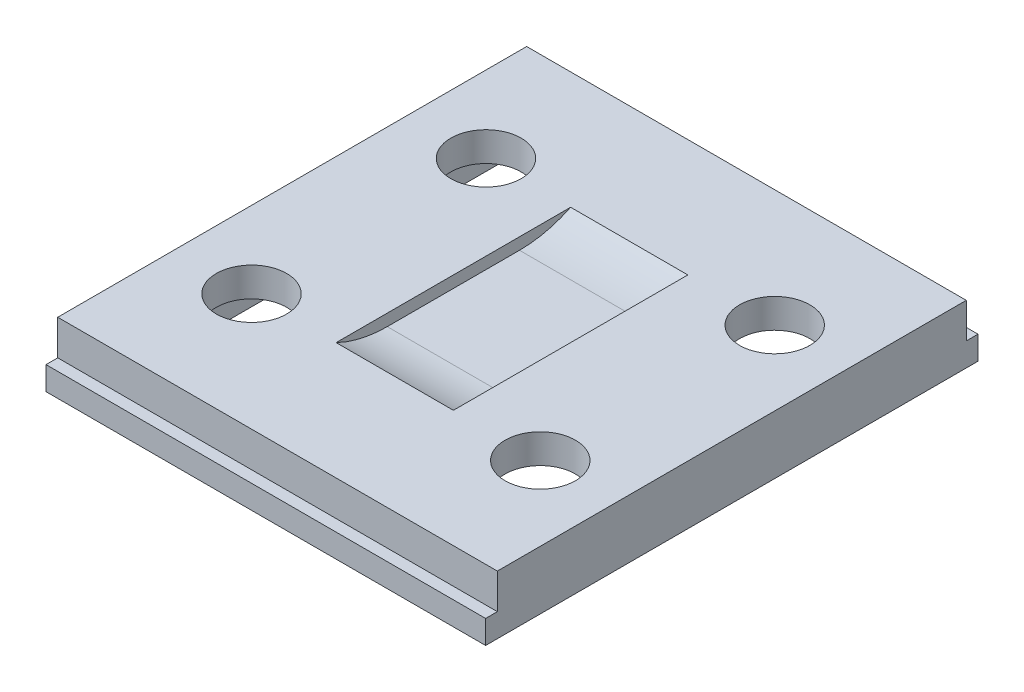
ISO-10303-21;
HEADER;
FILE_DESCRIPTION(('STEP AP214'),'2;1');
FILE_NAME('part.step','',(''),(''),'','','');
FILE_SCHEMA(('AUTOMOTIVE_DESIGN { 1 0 10303 214 1 1 1 1 }'));
ENDSEC;
DATA;
#1=APPLICATION_CONTEXT('core data for automotive mechanical design processes');
#2=APPLICATION_PROTOCOL_DEFINITION('international standard','automotive_design',2000,#1);
#3=PRODUCT_CONTEXT('',#1,'mechanical');
#4=PRODUCT('Part','Part','',(#3));
#5=PRODUCT_RELATED_PRODUCT_CATEGORY('part','',(#4));
#6=PRODUCT_DEFINITION_FORMATION('','',#4);
#7=PRODUCT_DEFINITION_CONTEXT('part definition',#1,'design');
#8=PRODUCT_DEFINITION('design','',#6,#7);
#9=PRODUCT_DEFINITION_SHAPE('','',#8);
#10=(LENGTH_UNIT() NAMED_UNIT(*) SI_UNIT(.MILLI.,.METRE.));
#11=(NAMED_UNIT(*) PLANE_ANGLE_UNIT() SI_UNIT($,.RADIAN.));
#12=(NAMED_UNIT(*) SI_UNIT($,.STERADIAN.) SOLID_ANGLE_UNIT());
#13=UNCERTAINTY_MEASURE_WITH_UNIT(LENGTH_MEASURE(1.E-05),#10,'distance_accuracy_value','');
#14=(GEOMETRIC_REPRESENTATION_CONTEXT(3) GLOBAL_UNCERTAINTY_ASSIGNED_CONTEXT((#13)) GLOBAL_UNIT_ASSIGNED_CONTEXT((#10,
#11,#12)) REPRESENTATION_CONTEXT('',''));
#15=CARTESIAN_POINT('',(0.,0.,0.));
#16=DIRECTION('',(0.,0.,1.));
#17=DIRECTION('',(1.,0.,0.));
#18=AXIS2_PLACEMENT_3D('',#15,#16,#17);
#19=CARTESIAN_POINT('',(-18.75,5.,-21.));
#20=DIRECTION('',(0.,0.,-1.));
#21=DIRECTION('',(-1.,0.,0.));
#22=AXIS2_PLACEMENT_3D('',#19,#20,#21);
#23=PLANE('',#22);
#24=DIRECTION('',(0.,-1.,0.));
#25=VECTOR('',#24,1.);
#26=CARTESIAN_POINT('',(-18.75,5.,-21.));
#27=LINE('',#26,#25);
#28=CARTESIAN_POINT('',(-18.75,2.,-21.));
#29=VERTEX_POINT('',#28);
#30=CARTESIAN_POINT('',(-18.75,0.,-21.));
#31=VERTEX_POINT('',#30);
#32=EDGE_CURVE('E307',#29,#31,#27,.T.);
#33=ORIENTED_EDGE('',*,*,#32,.F.);
#34=DIRECTION('',(-1.,0.,0.));
#35=VECTOR('',#34,1.);
#36=CARTESIAN_POINT('',(-18.75,2.,-21.));
#37=LINE('',#36,#35);
#38=CARTESIAN_POINT('',(18.75,2.,-21.));
#39=VERTEX_POINT('',#38);
#40=EDGE_CURVE('E263',#39,#29,#37,.T.);
#41=ORIENTED_EDGE('',*,*,#40,.F.);
#42=DIRECTION('',(0.,-1.,0.));
#43=VECTOR('',#42,1.);
#44=CARTESIAN_POINT('',(18.75,5.,-21.));
#45=LINE('',#44,#43);
#46=CARTESIAN_POINT('',(18.75,0.,-21.));
#47=VERTEX_POINT('',#46);
#48=EDGE_CURVE('E309',#39,#47,#45,.T.);
#49=ORIENTED_EDGE('',*,*,#48,.T.);
#50=DIRECTION('',(1.,0.,0.));
#51=VECTOR('',#50,1.);
#52=CARTESIAN_POINT('',(-18.75,0.,-21.));
#53=LINE('',#52,#51);
#54=EDGE_CURVE('E301',#31,#47,#53,.T.);
#55=ORIENTED_EDGE('',*,*,#54,.F.);
#56=EDGE_LOOP('',(#33,#41,#49,#55));
#57=FACE_BOUND('',#56,.T.);
#58=ADVANCED_FACE('F35',(#57),#23,.T.);
#59=CARTESIAN_POINT('',(-18.75,5.,21.));
#60=DIRECTION('',(0.,0.,-1.));
#61=DIRECTION('',(-1.,0.,0.));
#62=AXIS2_PLACEMENT_3D('',#59,#60,#61);
#63=PLANE('',#62);
#64=DIRECTION('',(0.,-1.,0.));
#65=VECTOR('',#64,1.);
#66=CARTESIAN_POINT('',(18.75,5.,21.));
#67=LINE('',#66,#65);
#68=CARTESIAN_POINT('',(18.75,2.,21.));
#69=VERTEX_POINT('',#68);
#70=CARTESIAN_POINT('',(18.75,0.,21.));
#71=VERTEX_POINT('',#70);
#72=EDGE_CURVE('E311',#69,#71,#67,.T.);
#73=ORIENTED_EDGE('',*,*,#72,.F.);
#74=DIRECTION('',(1.,0.,0.));
#75=VECTOR('',#74,1.);
#76=CARTESIAN_POINT('',(-18.75,2.,21.));
#77=LINE('',#76,#75);
#78=CARTESIAN_POINT('',(-18.75,2.,21.));
#79=VERTEX_POINT('',#78);
#80=EDGE_CURVE('E274',#79,#69,#77,.T.);
#81=ORIENTED_EDGE('',*,*,#80,.F.);
#82=DIRECTION('',(0.,-1.,0.));
#83=VECTOR('',#82,1.);
#84=CARTESIAN_POINT('',(-18.75,5.,21.));
#85=LINE('',#84,#83);
#86=CARTESIAN_POINT('',(-18.75,0.,21.));
#87=VERTEX_POINT('',#86);
#88=EDGE_CURVE('E295',#79,#87,#85,.T.);
#89=ORIENTED_EDGE('',*,*,#88,.T.);
#90=DIRECTION('',(1.,0.,0.));
#91=VECTOR('',#90,1.);
#92=CARTESIAN_POINT('',(-18.75,0.,21.));
#93=LINE('',#92,#91);
#94=EDGE_CURVE('E286',#87,#71,#93,.T.);
#95=ORIENTED_EDGE('',*,*,#94,.T.);
#96=EDGE_LOOP('',(#73,#81,#89,#95));
#97=FACE_BOUND('',#96,.T.);
#98=ADVANCED_FACE('F350',(#97),#63,.F.);
#99=CARTESIAN_POINT('',(18.75,5.,21.));
#100=DIRECTION('',(-1.,0.,0.));
#101=DIRECTION('',(0.,0.,1.));
#102=AXIS2_PLACEMENT_3D('',#99,#100,#101);
#103=PLANE('',#102);
#104=DIRECTION('',(0.,0.,-1.));
#105=VECTOR('',#104,1.);
#106=CARTESIAN_POINT('',(18.75,2.,-21.));
#107=LINE('',#106,#105);
#108=CARTESIAN_POINT('',(18.75,2.,-20.));
#109=VERTEX_POINT('',#108);
#110=EDGE_CURVE('E261',#109,#39,#107,.T.);
#111=ORIENTED_EDGE('',*,*,#110,.F.);
#112=DIRECTION('',(0.,1.,0.));
#113=VECTOR('',#112,1.);
#114=CARTESIAN_POINT('',(18.75,2.,-20.));
#115=LINE('',#114,#113);
#116=CARTESIAN_POINT('',(18.75,5.,-20.));
#117=VERTEX_POINT('',#116);
#118=EDGE_CURVE('E267',#109,#117,#115,.T.);
#119=ORIENTED_EDGE('',*,*,#118,.T.);
#120=DIRECTION('',(0.,0.,-1.));
#121=VECTOR('',#120,1.);
#122=CARTESIAN_POINT('',(18.75,5.,21.));
#123=LINE('',#122,#121);
#124=CARTESIAN_POINT('',(18.75,5.,20.));
#125=VERTEX_POINT('',#124);
#126=EDGE_CURVE('E288',#125,#117,#123,.T.);
#127=ORIENTED_EDGE('',*,*,#126,.F.);
#128=DIRECTION('',(0.,1.,0.));
#129=VECTOR('',#128,1.);
#130=CARTESIAN_POINT('',(18.75,2.,20.));
#131=LINE('',#130,#129);
#132=CARTESIAN_POINT('',(18.75,2.,20.));
#133=VERTEX_POINT('',#132);
#134=EDGE_CURVE('E281',#133,#125,#131,.T.);
#135=ORIENTED_EDGE('',*,*,#134,.F.);
#136=DIRECTION('',(0.,0.,-1.));
#137=VECTOR('',#136,1.);
#138=CARTESIAN_POINT('',(18.75,2.,21.));
#139=LINE('',#138,#137);
#140=EDGE_CURVE('E276',#69,#133,#139,.T.);
#141=ORIENTED_EDGE('',*,*,#140,.F.);
#142=ORIENTED_EDGE('',*,*,#72,.T.);
#143=DIRECTION('',(0.,0.,-1.));
#144=VECTOR('',#143,1.);
#145=CARTESIAN_POINT('',(18.75,0.,21.));
#146=LINE('',#145,#144);
#147=EDGE_CURVE('E298',#71,#47,#146,.T.);
#148=ORIENTED_EDGE('',*,*,#147,.T.);
#149=ORIENTED_EDGE('',*,*,#48,.F.);
#150=EDGE_LOOP('',(#111,#119,#127,#135,#141,#142,#148,#149));
#151=FACE_BOUND('',#150,.T.);
#152=ADVANCED_FACE('F356',(#151),#103,.F.);
#153=CARTESIAN_POINT('',(-18.75,5.,21.));
#154=DIRECTION('',(-1.,0.,0.));
#155=DIRECTION('',(0.,0.,1.));
#156=AXIS2_PLACEMENT_3D('',#153,#154,#155);
#157=PLANE('',#156);
#158=DIRECTION('',(0.,1.,0.));
#159=VECTOR('',#158,1.);
#160=CARTESIAN_POINT('',(-18.75,2.,-20.));
#161=LINE('',#160,#159);
#162=CARTESIAN_POINT('',(-18.75,2.,-20.));
#163=VERTEX_POINT('',#162);
#164=CARTESIAN_POINT('',(-18.75,5.,-20.));
#165=VERTEX_POINT('',#164);
#166=EDGE_CURVE('E265',#163,#165,#161,.T.);
#167=ORIENTED_EDGE('',*,*,#166,.F.);
#168=DIRECTION('',(0.,0.,1.));
#169=VECTOR('',#168,1.);
#170=CARTESIAN_POINT('',(-18.75,2.,-21.));
#171=LINE('',#170,#169);
#172=EDGE_CURVE('E255',#29,#163,#171,.T.);
#173=ORIENTED_EDGE('',*,*,#172,.F.);
#174=ORIENTED_EDGE('',*,*,#32,.T.);
#175=DIRECTION('',(0.,0.,-1.));
#176=VECTOR('',#175,1.);
#177=CARTESIAN_POINT('',(-18.75,0.,21.));
#178=LINE('',#177,#176);
#179=EDGE_CURVE('E292',#87,#31,#178,.T.);
#180=ORIENTED_EDGE('',*,*,#179,.F.);
#181=ORIENTED_EDGE('',*,*,#88,.F.);
#182=DIRECTION('',(0.,0.,1.));
#183=VECTOR('',#182,1.);
#184=CARTESIAN_POINT('',(-18.75,2.,21.));
#185=LINE('',#184,#183);
#186=CARTESIAN_POINT('',(-18.75,2.,20.));
#187=VERTEX_POINT('',#186);
#188=EDGE_CURVE('E272',#187,#79,#185,.T.);
#189=ORIENTED_EDGE('',*,*,#188,.F.);
#190=DIRECTION('',(0.,1.,0.));
#191=VECTOR('',#190,1.);
#192=CARTESIAN_POINT('',(-18.75,2.,20.));
#193=LINE('',#192,#191);
#194=CARTESIAN_POINT('',(-18.75,5.,20.));
#195=VERTEX_POINT('',#194);
#196=EDGE_CURVE('E283',#187,#195,#193,.T.);
#197=ORIENTED_EDGE('',*,*,#196,.T.);
#198=DIRECTION('',(0.,0.,-1.));
#199=VECTOR('',#198,1.);
#200=CARTESIAN_POINT('',(-18.75,5.,21.));
#201=LINE('',#200,#199);
#202=EDGE_CURVE('E291',#195,#165,#201,.T.);
#203=ORIENTED_EDGE('',*,*,#202,.T.);
#204=EDGE_LOOP('',(#167,#173,#174,#180,#181,#189,#197,#203));
#205=FACE_BOUND('',#204,.T.);
#206=ADVANCED_FACE('F361',(#205),#157,.T.);
#207=CARTESIAN_POINT('',(0.,5.,0.));
#208=DIRECTION('',(0.,1.,0.));
#209=DIRECTION('',(0.,0.,1.));
#210=AXIS2_PLACEMENT_3D('',#207,#208,#209);
#211=PLANE('',#210);
#212=CARTESIAN_POINT('',(-12.2200025291193,5.,-10.));
#213=DIRECTION('',(0.,1.,0.));
#214=DIRECTION('',(0.,0.,1.));
#215=AXIS2_PLACEMENT_3D('',#212,#213,#214);
#216=CIRCLE('',#215,3.);
#217=CARTESIAN_POINT('',(-12.2200025291193,5.,-7.));
#218=VERTEX_POINT('',#217);
#219=EDGE_CURVE('E488',#218,#218,#216,.T.);
#220=ORIENTED_EDGE('',*,*,#219,.F.);
#221=EDGE_LOOP('',(#220));
#222=FACE_BOUND('',#221,.T.);
#223=CARTESIAN_POINT('',(12.4119716573148,5.,10.));
#224=DIRECTION('',(0.,1.,0.));
#225=DIRECTION('',(0.,0.,1.));
#226=AXIS2_PLACEMENT_3D('',#223,#224,#225);
#227=CIRCLE('',#226,3.);
#228=CARTESIAN_POINT('',(12.4119716573148,5.,13.));
#229=VERTEX_POINT('',#228);
#230=EDGE_CURVE('E481',#229,#229,#227,.T.);
#231=ORIENTED_EDGE('',*,*,#230,.F.);
#232=EDGE_LOOP('',(#231));
#233=FACE_BOUND('',#232,.T.);
#234=CARTESIAN_POINT('',(12.4119716573148,5.,-10.));
#235=DIRECTION('',(0.,1.,0.));
#236=DIRECTION('',(0.,0.,1.));
#237=AXIS2_PLACEMENT_3D('',#234,#235,#236);
#238=CIRCLE('',#237,3.);
#239=CARTESIAN_POINT('',(12.4119716573148,5.,-7.));
#240=VERTEX_POINT('',#239);
#241=EDGE_CURVE('E478',#240,#240,#238,.T.);
#242=ORIENTED_EDGE('',*,*,#241,.F.);
#243=EDGE_LOOP('',(#242));
#244=FACE_BOUND('',#243,.T.);
#245=CARTESIAN_POINT('',(-12.2200025291193,5.,10.));
#246=DIRECTION('',(0.,1.,0.));
#247=DIRECTION('',(0.,0.,1.));
#248=AXIS2_PLACEMENT_3D('',#245,#246,#247);
#249=CIRCLE('',#248,3.);
#250=CARTESIAN_POINT('',(-12.2200025291193,5.,13.));
#251=VERTEX_POINT('',#250);
#252=EDGE_CURVE('E487',#251,#251,#249,.T.);
#253=ORIENTED_EDGE('',*,*,#252,.F.);
#254=EDGE_LOOP('',(#253));
#255=FACE_BOUND('',#254,.T.);
#256=DIRECTION('',(0.,0.,-1.));
#257=VECTOR('',#256,1.);
#258=CARTESIAN_POINT('',(5.,5.,10.));
#259=LINE('',#258,#257);
#260=CARTESIAN_POINT('',(5.,5.,10.));
#261=VERTEX_POINT('',#260);
#262=CARTESIAN_POINT('',(5.,5.,-10.));
#263=VERTEX_POINT('',#262);
#264=EDGE_CURVE('E240',#261,#263,#259,.T.);
#265=ORIENTED_EDGE('',*,*,#264,.F.);
#266=DIRECTION('',(1.,0.,0.));
#267=VECTOR('',#266,1.);
#268=CARTESIAN_POINT('',(-5.,5.,10.));
#269=LINE('',#268,#267);
#270=CARTESIAN_POINT('',(-5.,5.,10.));
#271=VERTEX_POINT('',#270);
#272=EDGE_CURVE('E244',#271,#261,#269,.T.);
#273=ORIENTED_EDGE('',*,*,#272,.F.);
#274=DIRECTION('',(0.,0.,1.));
#275=VECTOR('',#274,1.);
#276=CARTESIAN_POINT('',(-5.,5.,10.));
#277=LINE('',#276,#275);
#278=CARTESIAN_POINT('',(-5.,5.,-10.));
#279=VERTEX_POINT('',#278);
#280=EDGE_CURVE('E251',#279,#271,#277,.T.);
#281=ORIENTED_EDGE('',*,*,#280,.F.);
#282=DIRECTION('',(-1.,0.,0.));
#283=VECTOR('',#282,1.);
#284=CARTESIAN_POINT('',(-5.,5.,-10.));
#285=LINE('',#284,#283);
#286=EDGE_CURVE('E248',#263,#279,#285,.T.);
#287=ORIENTED_EDGE('',*,*,#286,.F.);
#288=EDGE_LOOP('',(#265,#273,#281,#287));
#289=FACE_BOUND('',#288,.T.);
#290=DIRECTION('',(1.,0.,0.));
#291=VECTOR('',#290,1.);
#292=CARTESIAN_POINT('',(-18.75,5.,-20.));
#293=LINE('',#292,#291);
#294=EDGE_CURVE('E246',#165,#117,#293,.T.);
#295=ORIENTED_EDGE('',*,*,#294,.F.);
#296=ORIENTED_EDGE('',*,*,#202,.F.);
#297=DIRECTION('',(-1.,0.,0.));
#298=VECTOR('',#297,1.);
#299=CARTESIAN_POINT('',(-18.75,5.,20.));
#300=LINE('',#299,#298);
#301=EDGE_CURVE('E270',#125,#195,#300,.T.);
#302=ORIENTED_EDGE('',*,*,#301,.F.);
#303=ORIENTED_EDGE('',*,*,#126,.T.);
#304=EDGE_LOOP('',(#295,#296,#302,#303));
#305=FACE_BOUND('',#304,.T.);
#306=ADVANCED_FACE('F332',(#222,#233,#244,#255,#289,#305),#211,.T.);
#307=CARTESIAN_POINT('',(0.,0.,0.));
#308=DIRECTION('',(0.,1.,0.));
#309=DIRECTION('',(0.,0.,1.));
#310=AXIS2_PLACEMENT_3D('',#307,#308,#309);
#311=PLANE('',#310);
#312=DIRECTION('',(0.,0.,-1.));
#313=VECTOR('',#312,1.);
#314=CARTESIAN_POINT('',(-16.25,0.,21.));
#315=LINE('',#314,#313);
#316=CARTESIAN_POINT('',(-16.25,0.,17.5));
#317=VERTEX_POINT('',#316);
#318=CARTESIAN_POINT('',(-16.25,0.,-17.5));
#319=VERTEX_POINT('',#318);
#320=EDGE_CURVE('E193',#317,#319,#315,.T.);
#321=ORIENTED_EDGE('',*,*,#320,.F.);
#322=DIRECTION('',(1.,0.,0.));
#323=VECTOR('',#322,1.);
#324=CARTESIAN_POINT('',(-18.75,0.,17.5));
#325=LINE('',#324,#323);
#326=CARTESIAN_POINT('',(16.25,0.,17.5));
#327=VERTEX_POINT('',#326);
#328=EDGE_CURVE('E238',#317,#327,#325,.T.);
#329=ORIENTED_EDGE('',*,*,#328,.T.);
#330=DIRECTION('',(0.,0.,-1.));
#331=VECTOR('',#330,1.);
#332=CARTESIAN_POINT('',(16.25,0.,21.));
#333=LINE('',#332,#331);
#334=CARTESIAN_POINT('',(16.25,0.,-17.5));
#335=VERTEX_POINT('',#334);
#336=EDGE_CURVE('E175',#327,#335,#333,.T.);
#337=ORIENTED_EDGE('',*,*,#336,.T.);
#338=DIRECTION('',(1.,0.,0.));
#339=VECTOR('',#338,1.);
#340=CARTESIAN_POINT('',(0.,0.,-17.5));
#341=LINE('',#340,#339);
#342=EDGE_CURVE('E234',#319,#335,#341,.T.);
#343=ORIENTED_EDGE('',*,*,#342,.F.);
#344=EDGE_LOOP('',(#321,#329,#337,#343));
#345=FACE_BOUND('',#344,.T.);
#346=ORIENTED_EDGE('',*,*,#94,.F.);
#347=ORIENTED_EDGE('',*,*,#179,.T.);
#348=ORIENTED_EDGE('',*,*,#54,.T.);
#349=ORIENTED_EDGE('',*,*,#147,.F.);
#350=EDGE_LOOP('',(#346,#347,#348,#349));
#351=FACE_BOUND('',#350,.T.);
#352=ADVANCED_FACE('F398',(#345,#351),#311,.F.);
#353=CARTESIAN_POINT('',(-18.75,2.,20.));
#354=DIRECTION('',(0.,0.,-1.));
#355=DIRECTION('',(-1.,0.,0.));
#356=AXIS2_PLACEMENT_3D('',#353,#354,#355);
#357=PLANE('',#356);
#358=ORIENTED_EDGE('',*,*,#301,.T.);
#359=ORIENTED_EDGE('',*,*,#196,.F.);
#360=DIRECTION('',(-1.,0.,0.));
#361=VECTOR('',#360,1.);
#362=CARTESIAN_POINT('',(-18.75,2.,20.));
#363=LINE('',#362,#361);
#364=EDGE_CURVE('E278',#133,#187,#363,.T.);
#365=ORIENTED_EDGE('',*,*,#364,.F.);
#366=ORIENTED_EDGE('',*,*,#134,.T.);
#367=EDGE_LOOP('',(#358,#359,#365,#366));
#368=FACE_BOUND('',#367,.T.);
#369=ADVANCED_FACE('F390',(#368),#357,.F.);
#370=CARTESIAN_POINT('',(0.,2.,0.));
#371=DIRECTION('',(0.,-1.,0.));
#372=DIRECTION('',(0.,0.,-1.));
#373=AXIS2_PLACEMENT_3D('',#370,#371,#372);
#374=PLANE('',#373);
#375=ORIENTED_EDGE('',*,*,#188,.T.);
#376=ORIENTED_EDGE('',*,*,#80,.T.);
#377=ORIENTED_EDGE('',*,*,#140,.T.);
#378=ORIENTED_EDGE('',*,*,#364,.T.);
#379=EDGE_LOOP('',(#375,#376,#377,#378));
#380=FACE_BOUND('',#379,.T.);
#381=ADVANCED_FACE('F393',(#380),#374,.F.);
#382=CARTESIAN_POINT('',(-18.75,2.,-20.));
#383=DIRECTION('',(0.,0.,1.));
#384=DIRECTION('',(1.,0.,0.));
#385=AXIS2_PLACEMENT_3D('',#382,#383,#384);
#386=PLANE('',#385);
#387=ORIENTED_EDGE('',*,*,#294,.T.);
#388=ORIENTED_EDGE('',*,*,#118,.F.);
#389=DIRECTION('',(1.,0.,0.));
#390=VECTOR('',#389,1.);
#391=CARTESIAN_POINT('',(-18.75,2.,-20.));
#392=LINE('',#391,#390);
#393=EDGE_CURVE('E258',#163,#109,#392,.T.);
#394=ORIENTED_EDGE('',*,*,#393,.F.);
#395=ORIENTED_EDGE('',*,*,#166,.T.);
#396=EDGE_LOOP('',(#387,#388,#394,#395));
#397=FACE_BOUND('',#396,.T.);
#398=ADVANCED_FACE('F383',(#397),#386,.F.);
#399=CARTESIAN_POINT('',(0.,2.,0.));
#400=DIRECTION('',(0.,1.,0.));
#401=DIRECTION('',(0.,0.,1.));
#402=AXIS2_PLACEMENT_3D('',#399,#400,#401);
#403=PLANE('',#402);
#404=ORIENTED_EDGE('',*,*,#172,.T.);
#405=ORIENTED_EDGE('',*,*,#393,.T.);
#406=ORIENTED_EDGE('',*,*,#110,.T.);
#407=ORIENTED_EDGE('',*,*,#40,.T.);
#408=EDGE_LOOP('',(#404,#405,#406,#407));
#409=FACE_BOUND('',#408,.T.);
#410=ADVANCED_FACE('F374',(#409),#403,.T.);
#411=CARTESIAN_POINT('',(5.,4.,10.));
#412=DIRECTION('',(1.,0.,0.));
#413=DIRECTION('',(0.,0.,-1.));
#414=AXIS2_PLACEMENT_3D('',#411,#412,#413);
#415=PLANE('',#414);
#416=DIRECTION('',(0.,0.,-1.));
#417=VECTOR('',#416,1.);
#418=CARTESIAN_POINT('',(5.,4.,10.));
#419=LINE('',#418,#417);
#420=CARTESIAN_POINT('',(5.,4.,5.64110105645933));
#421=VERTEX_POINT('',#420);
#422=CARTESIAN_POINT('',(5.,4.,-5.64110105645933));
#423=VERTEX_POINT('',#422);
#424=EDGE_CURVE('E241',#421,#423,#419,.T.);
#425=ORIENTED_EDGE('',*,*,#424,.F.);
#426=CARTESIAN_POINT('',(5.,14.,5.64110105645933));
#427=DIRECTION('',(1.,0.,0.));
#428=DIRECTION('',(0.,0.,-1.));
#429=AXIS2_PLACEMENT_3D('',#426,#427,#428);
#430=CIRCLE('',#429,10.);
#431=EDGE_CURVE('E43',#421,#261,#430,.F.);
#432=ORIENTED_EDGE('',*,*,#431,.T.);
#433=ORIENTED_EDGE('',*,*,#264,.T.);
#434=CARTESIAN_POINT('',(5.,14.,-5.64110105645933));
#435=DIRECTION('',(1.,0.,0.));
#436=DIRECTION('',(0.,0.,-1.));
#437=AXIS2_PLACEMENT_3D('',#434,#435,#436);
#438=CIRCLE('',#437,10.);
#439=EDGE_CURVE('E318',#263,#423,#438,.F.);
#440=ORIENTED_EDGE('',*,*,#439,.T.);
#441=EDGE_LOOP('',(#425,#432,#433,#440));
#442=FACE_BOUND('',#441,.T.);
#443=ADVANCED_FACE('F326',(#442),#415,.F.);
#444=CARTESIAN_POINT('',(-5.,4.,10.));
#445=DIRECTION('',(-1.,0.,0.));
#446=DIRECTION('',(0.,0.,1.));
#447=AXIS2_PLACEMENT_3D('',#444,#445,#446);
#448=PLANE('',#447);
#449=ORIENTED_EDGE('',*,*,#280,.T.);
#450=CARTESIAN_POINT('',(-5.,14.,5.64110105645933));
#451=DIRECTION('',(-1.,0.,0.));
#452=DIRECTION('',(0.,0.,1.));
#453=AXIS2_PLACEMENT_3D('',#450,#451,#452);
#454=CIRCLE('',#453,10.);
#455=CARTESIAN_POINT('',(-5.,4.,5.64110105645933));
#456=VERTEX_POINT('',#455);
#457=EDGE_CURVE('E11',#271,#456,#454,.F.);
#458=ORIENTED_EDGE('',*,*,#457,.T.);
#459=DIRECTION('',(0.,0.,1.));
#460=VECTOR('',#459,1.);
#461=CARTESIAN_POINT('',(-5.,4.,10.));
#462=LINE('',#461,#460);
#463=CARTESIAN_POINT('',(-5.,4.,-5.64110105645933));
#464=VERTEX_POINT('',#463);
#465=EDGE_CURVE('E243',#464,#456,#462,.T.);
#466=ORIENTED_EDGE('',*,*,#465,.F.);
#467=CARTESIAN_POINT('',(-5.,14.,-5.64110105645933));
#468=DIRECTION('',(-1.,0.,0.));
#469=DIRECTION('',(0.,0.,1.));
#470=AXIS2_PLACEMENT_3D('',#467,#468,#469);
#471=CIRCLE('',#470,10.);
#472=EDGE_CURVE('E316',#464,#279,#471,.F.);
#473=ORIENTED_EDGE('',*,*,#472,.T.);
#474=EDGE_LOOP('',(#449,#458,#466,#473));
#475=FACE_BOUND('',#474,.T.);
#476=ADVANCED_FACE('F339',(#475),#448,.F.);
#477=CARTESIAN_POINT('',(0.,4.,0.));
#478=DIRECTION('',(0.,-1.,0.));
#479=DIRECTION('',(0.,0.,-1.));
#480=AXIS2_PLACEMENT_3D('',#477,#478,#479);
#481=PLANE('',#480);
#482=ORIENTED_EDGE('',*,*,#465,.T.);
#483=DIRECTION('',(-1.,0.,0.));
#484=VECTOR('',#483,1.);
#485=CARTESIAN_POINT('',(0.,4.,5.64110105645933));
#486=LINE('',#485,#484);
#487=EDGE_CURVE('E321',#456,#421,#486,.F.);
#488=ORIENTED_EDGE('',*,*,#487,.T.);
#489=ORIENTED_EDGE('',*,*,#424,.T.);
#490=DIRECTION('',(1.,0.,0.));
#491=VECTOR('',#490,1.);
#492=CARTESIAN_POINT('',(0.,4.,-5.64110105645933));
#493=LINE('',#492,#491);
#494=EDGE_CURVE('E313',#423,#464,#493,.F.);
#495=ORIENTED_EDGE('',*,*,#494,.T.);
#496=EDGE_LOOP('',(#482,#488,#489,#495));
#497=FACE_BOUND('',#496,.T.);
#498=ADVANCED_FACE('F337',(#497),#481,.F.);
#499=CARTESIAN_POINT('',(-5.,14.,-5.64110105645933));
#500=DIRECTION('',(1.,0.,0.));
#501=DIRECTION('',(0.,0.,-1.));
#502=AXIS2_PLACEMENT_3D('',#499,#500,#501);
#503=CYLINDRICAL_SURFACE('',#502,10.);
#504=ORIENTED_EDGE('',*,*,#439,.F.);
#505=ORIENTED_EDGE('',*,*,#286,.T.);
#506=ORIENTED_EDGE('',*,*,#472,.F.);
#507=ORIENTED_EDGE('',*,*,#494,.F.);
#508=EDGE_LOOP('',(#504,#505,#506,#507));
#509=FACE_BOUND('',#508,.T.);
#510=ADVANCED_FACE('F341',(#509),#503,.F.);
#511=CARTESIAN_POINT('',(-5.,14.,5.64110105645933));
#512=DIRECTION('',(-1.,0.,0.));
#513=DIRECTION('',(0.,0.,1.));
#514=AXIS2_PLACEMENT_3D('',#511,#512,#513);
#515=CYLINDRICAL_SURFACE('',#514,10.);
#516=ORIENTED_EDGE('',*,*,#457,.F.);
#517=ORIENTED_EDGE('',*,*,#272,.T.);
#518=ORIENTED_EDGE('',*,*,#431,.F.);
#519=ORIENTED_EDGE('',*,*,#487,.F.);
#520=EDGE_LOOP('',(#516,#517,#518,#519));
#521=FACE_BOUND('',#520,.T.);
#522=ADVANCED_FACE('F37',(#521),#515,.F.);
#523=CARTESIAN_POINT('',(16.25,5.,21.));
#524=DIRECTION('',(-1.,0.,0.));
#525=DIRECTION('',(0.,0.,1.));
#526=AXIS2_PLACEMENT_3D('',#523,#524,#525);
#527=PLANE('',#526);
#528=ORIENTED_EDGE('',*,*,#336,.F.);
#529=DIRECTION('',(0.,1.,0.));
#530=VECTOR('',#529,1.);
#531=CARTESIAN_POINT('',(16.25,2.,17.5));
#532=LINE('',#531,#530);
#533=CARTESIAN_POINT('',(16.25,2.5,17.5));
#534=VERTEX_POINT('',#533);
#535=EDGE_CURVE('E169',#327,#534,#532,.T.);
#536=ORIENTED_EDGE('',*,*,#535,.T.);
#537=DIRECTION('',(0.,0.,-1.));
#538=VECTOR('',#537,1.);
#539=CARTESIAN_POINT('',(16.25,2.5,21.));
#540=LINE('',#539,#538);
#541=CARTESIAN_POINT('',(16.25,2.5,-17.5));
#542=VERTEX_POINT('',#541);
#543=EDGE_CURVE('E173',#534,#542,#540,.T.);
#544=ORIENTED_EDGE('',*,*,#543,.T.);
#545=DIRECTION('',(0.,1.,0.));
#546=VECTOR('',#545,1.);
#547=CARTESIAN_POINT('',(16.25,5.,-17.5));
#548=LINE('',#547,#546);
#549=EDGE_CURVE('E50',#335,#542,#548,.T.);
#550=ORIENTED_EDGE('',*,*,#549,.F.);
#551=EDGE_LOOP('',(#528,#536,#544,#550));
#552=FACE_BOUND('',#551,.T.);
#553=ADVANCED_FACE('F171',(#552),#527,.T.);
#554=CARTESIAN_POINT('',(-16.25,5.,21.));
#555=DIRECTION('',(-1.,0.,0.));
#556=DIRECTION('',(0.,0.,1.));
#557=AXIS2_PLACEMENT_3D('',#554,#555,#556);
#558=PLANE('',#557);
#559=DIRECTION('',(0.,1.,0.));
#560=VECTOR('',#559,1.);
#561=CARTESIAN_POINT('',(-16.25,5.,-17.5));
#562=LINE('',#561,#560);
#563=CARTESIAN_POINT('',(-16.25,2.5,-17.5));
#564=VERTEX_POINT('',#563);
#565=EDGE_CURVE('E201',#319,#564,#562,.T.);
#566=ORIENTED_EDGE('',*,*,#565,.T.);
#567=DIRECTION('',(0.,0.,-1.));
#568=VECTOR('',#567,1.);
#569=CARTESIAN_POINT('',(-16.25,2.5,21.));
#570=LINE('',#569,#568);
#571=CARTESIAN_POINT('',(-16.25,2.5,17.5));
#572=VERTEX_POINT('',#571);
#573=EDGE_CURVE('E192',#572,#564,#570,.T.);
#574=ORIENTED_EDGE('',*,*,#573,.F.);
#575=DIRECTION('',(0.,1.,0.));
#576=VECTOR('',#575,1.);
#577=CARTESIAN_POINT('',(-16.25,2.,17.5));
#578=LINE('',#577,#576);
#579=EDGE_CURVE('E178',#317,#572,#578,.T.);
#580=ORIENTED_EDGE('',*,*,#579,.F.);
#581=ORIENTED_EDGE('',*,*,#320,.T.);
#582=EDGE_LOOP('',(#566,#574,#580,#581));
#583=FACE_BOUND('',#582,.T.);
#584=ADVANCED_FACE('F449',(#583),#558,.F.);
#585=CARTESIAN_POINT('',(0.,2.5,0.));
#586=DIRECTION('',(0.,1.,0.));
#587=DIRECTION('',(0.,0.,1.));
#588=AXIS2_PLACEMENT_3D('',#585,#586,#587);
#589=PLANE('',#588);
#590=CARTESIAN_POINT('',(-12.2200025291193,2.5,-10.));
#591=DIRECTION('',(0.,1.,0.));
#592=DIRECTION('',(0.,0.,1.));
#593=AXIS2_PLACEMENT_3D('',#590,#591,#592);
#594=CIRCLE('',#593,3.);
#595=CARTESIAN_POINT('',(-12.2200025291193,2.5,-7.));
#596=VERTEX_POINT('',#595);
#597=EDGE_CURVE('E484',#596,#596,#594,.T.);
#598=ORIENTED_EDGE('',*,*,#597,.T.);
#599=EDGE_LOOP('',(#598));
#600=FACE_BOUND('',#599,.T.);
#601=CARTESIAN_POINT('',(12.4119716573148,2.5,10.));
#602=DIRECTION('',(0.,1.,0.));
#603=DIRECTION('',(0.,0.,1.));
#604=AXIS2_PLACEMENT_3D('',#601,#602,#603);
#605=CIRCLE('',#604,3.);
#606=CARTESIAN_POINT('',(12.4119716573148,2.5,13.));
#607=VERTEX_POINT('',#606);
#608=EDGE_CURVE('E491',#607,#607,#605,.T.);
#609=ORIENTED_EDGE('',*,*,#608,.T.);
#610=EDGE_LOOP('',(#609));
#611=FACE_BOUND('',#610,.T.);
#612=CARTESIAN_POINT('',(12.4119716573148,2.5,-10.));
#613=DIRECTION('',(0.,1.,0.));
#614=DIRECTION('',(0.,0.,1.));
#615=AXIS2_PLACEMENT_3D('',#612,#613,#614);
#616=CIRCLE('',#615,3.);
#617=CARTESIAN_POINT('',(12.4119716573148,2.5,-7.));
#618=VERTEX_POINT('',#617);
#619=EDGE_CURVE('E475',#618,#618,#616,.T.);
#620=ORIENTED_EDGE('',*,*,#619,.T.);
#621=EDGE_LOOP('',(#620));
#622=FACE_BOUND('',#621,.T.);
#623=CARTESIAN_POINT('',(-12.2200025291193,2.5,10.));
#624=DIRECTION('',(0.,1.,0.));
#625=DIRECTION('',(0.,0.,1.));
#626=AXIS2_PLACEMENT_3D('',#623,#624,#625);
#627=CIRCLE('',#626,3.);
#628=CARTESIAN_POINT('',(-12.2200025291193,2.5,13.));
#629=VERTEX_POINT('',#628);
#630=EDGE_CURVE('E207',#629,#629,#627,.T.);
#631=ORIENTED_EDGE('',*,*,#630,.T.);
#632=EDGE_LOOP('',(#631));
#633=FACE_BOUND('',#632,.T.);
#634=DIRECTION('',(0.,0.,-1.));
#635=VECTOR('',#634,1.);
#636=CARTESIAN_POINT('',(7.5,2.5,0.));
#637=LINE('',#636,#635);
#638=CARTESIAN_POINT('',(7.5,2.5,10.5400805420257));
#639=VERTEX_POINT('',#638);
#640=CARTESIAN_POINT('',(7.5,2.5,-10.5400805420257));
#641=VERTEX_POINT('',#640);
#642=EDGE_CURVE('E204',#639,#641,#637,.T.);
#643=ORIENTED_EDGE('',*,*,#642,.T.);
#644=DIRECTION('',(1.,0.,0.));
#645=VECTOR('',#644,1.);
#646=CARTESIAN_POINT('',(7.5,2.5,-10.5400805420257));
#647=LINE('',#646,#645);
#648=CARTESIAN_POINT('',(-7.5,2.5,-10.5400805420257));
#649=VERTEX_POINT('',#648);
#650=EDGE_CURVE('E206',#641,#649,#647,.F.);
#651=ORIENTED_EDGE('',*,*,#650,.T.);
#652=DIRECTION('',(0.,0.,1.));
#653=VECTOR('',#652,1.);
#654=CARTESIAN_POINT('',(-7.5,2.5,0.));
#655=LINE('',#654,#653);
#656=CARTESIAN_POINT('',(-7.5,2.5,10.5400805420257));
#657=VERTEX_POINT('',#656);
#658=EDGE_CURVE('E212',#649,#657,#655,.T.);
#659=ORIENTED_EDGE('',*,*,#658,.T.);
#660=DIRECTION('',(-1.,0.,0.));
#661=VECTOR('',#660,1.);
#662=CARTESIAN_POINT('',(-7.5,2.5,10.5400805420257));
#663=LINE('',#662,#661);
#664=EDGE_CURVE('E208',#657,#639,#663,.F.);
#665=ORIENTED_EDGE('',*,*,#664,.T.);
#666=EDGE_LOOP('',(#643,#651,#659,#665));
#667=FACE_BOUND('',#666,.T.);
#668=DIRECTION('',(1.,0.,0.));
#669=VECTOR('',#668,1.);
#670=CARTESIAN_POINT('',(0.,2.5,-17.5));
#671=LINE('',#670,#669);
#672=EDGE_CURVE('E191',#564,#542,#671,.T.);
#673=ORIENTED_EDGE('',*,*,#672,.T.);
#674=ORIENTED_EDGE('',*,*,#543,.F.);
#675=DIRECTION('',(-1.,0.,0.));
#676=VECTOR('',#675,1.);
#677=CARTESIAN_POINT('',(0.,2.5,17.5));
#678=LINE('',#677,#676);
#679=EDGE_CURVE('E179',#534,#572,#678,.T.);
#680=ORIENTED_EDGE('',*,*,#679,.T.);
#681=ORIENTED_EDGE('',*,*,#573,.T.);
#682=EDGE_LOOP('',(#673,#674,#680,#681));
#683=FACE_BOUND('',#682,.T.);
#684=ADVANCED_FACE('F189',(#600,#611,#622,#633,#667,#683),#589,.F.);
#685=CARTESIAN_POINT('',(-18.75,2.,17.5));
#686=DIRECTION('',(0.,0.,-1.));
#687=DIRECTION('',(-1.,0.,0.));
#688=AXIS2_PLACEMENT_3D('',#685,#686,#687);
#689=PLANE('',#688);
#690=ORIENTED_EDGE('',*,*,#579,.T.);
#691=ORIENTED_EDGE('',*,*,#679,.F.);
#692=ORIENTED_EDGE('',*,*,#535,.F.);
#693=ORIENTED_EDGE('',*,*,#328,.F.);
#694=EDGE_LOOP('',(#690,#691,#692,#693));
#695=FACE_BOUND('',#694,.T.);
#696=ADVANCED_FACE('F182',(#695),#689,.T.);
#697=CARTESIAN_POINT('',(-18.75,2.,-17.5));
#698=DIRECTION('',(0.,0.,1.));
#699=DIRECTION('',(1.,0.,0.));
#700=AXIS2_PLACEMENT_3D('',#697,#698,#699);
#701=PLANE('',#700);
#702=ORIENTED_EDGE('',*,*,#342,.T.);
#703=ORIENTED_EDGE('',*,*,#549,.T.);
#704=ORIENTED_EDGE('',*,*,#672,.F.);
#705=ORIENTED_EDGE('',*,*,#565,.F.);
#706=EDGE_LOOP('',(#702,#703,#704,#705));
#707=FACE_BOUND('',#706,.T.);
#708=ADVANCED_FACE('F440',(#707),#701,.T.);
#709=CARTESIAN_POINT('',(7.5,4.,10.));
#710=DIRECTION('',(1.,0.,0.));
#711=DIRECTION('',(0.,0.,-1.));
#712=AXIS2_PLACEMENT_3D('',#709,#710,#711);
#713=PLANE('',#712);
#714=DIRECTION('',(0.,0.,-1.));
#715=VECTOR('',#714,1.);
#716=CARTESIAN_POINT('',(7.5,1.5,10.));
#717=LINE('',#716,#715);
#718=CARTESIAN_POINT('',(7.5,1.5,5.64110105645933));
#719=VERTEX_POINT('',#718);
#720=CARTESIAN_POINT('',(7.5,1.5,-5.64110105645933));
#721=VERTEX_POINT('',#720);
#722=EDGE_CURVE('E211',#719,#721,#717,.T.);
#723=ORIENTED_EDGE('',*,*,#722,.T.);
#724=CARTESIAN_POINT('',(7.5,14.,-5.64110105645933));
#725=DIRECTION('',(1.,0.,0.));
#726=DIRECTION('',(0.,0.,-1.));
#727=AXIS2_PLACEMENT_3D('',#724,#725,#726);
#728=CIRCLE('',#727,12.5);
#729=EDGE_CURVE('E223',#641,#721,#728,.F.);
#730=ORIENTED_EDGE('',*,*,#729,.F.);
#731=ORIENTED_EDGE('',*,*,#642,.F.);
#732=CARTESIAN_POINT('',(7.5,14.,5.64110105645933));
#733=DIRECTION('',(1.,0.,0.));
#734=DIRECTION('',(0.,0.,-1.));
#735=AXIS2_PLACEMENT_3D('',#732,#733,#734);
#736=CIRCLE('',#735,12.5);
#737=EDGE_CURVE('E219',#719,#639,#736,.F.);
#738=ORIENTED_EDGE('',*,*,#737,.F.);
#739=EDGE_LOOP('',(#723,#730,#731,#738));
#740=FACE_BOUND('',#739,.T.);
#741=ADVANCED_FACE('F436',(#740),#713,.T.);
#742=CARTESIAN_POINT('',(-7.5,4.,10.));
#743=DIRECTION('',(-1.,0.,0.));
#744=DIRECTION('',(0.,0.,1.));
#745=AXIS2_PLACEMENT_3D('',#742,#743,#744);
#746=PLANE('',#745);
#747=ORIENTED_EDGE('',*,*,#658,.F.);
#748=CARTESIAN_POINT('',(-7.5,14.,-5.64110105645933));
#749=DIRECTION('',(-1.,0.,0.));
#750=DIRECTION('',(0.,0.,1.));
#751=AXIS2_PLACEMENT_3D('',#748,#749,#750);
#752=CIRCLE('',#751,12.5);
#753=CARTESIAN_POINT('',(-7.5,1.5,-5.64110105645933));
#754=VERTEX_POINT('',#753);
#755=EDGE_CURVE('E226',#754,#649,#752,.F.);
#756=ORIENTED_EDGE('',*,*,#755,.F.);
#757=DIRECTION('',(0.,0.,1.));
#758=VECTOR('',#757,1.);
#759=CARTESIAN_POINT('',(-7.5,1.5,10.));
#760=LINE('',#759,#758);
#761=CARTESIAN_POINT('',(-7.5,1.5,5.64110105645933));
#762=VERTEX_POINT('',#761);
#763=EDGE_CURVE('E216',#754,#762,#760,.T.);
#764=ORIENTED_EDGE('',*,*,#763,.T.);
#765=CARTESIAN_POINT('',(-7.5,14.,5.64110105645933));
#766=DIRECTION('',(-1.,0.,0.));
#767=DIRECTION('',(0.,0.,1.));
#768=AXIS2_PLACEMENT_3D('',#765,#766,#767);
#769=CIRCLE('',#768,12.5);
#770=EDGE_CURVE('E221',#657,#762,#769,.F.);
#771=ORIENTED_EDGE('',*,*,#770,.F.);
#772=EDGE_LOOP('',(#747,#756,#764,#771));
#773=FACE_BOUND('',#772,.T.);
#774=ADVANCED_FACE('F432',(#773),#746,.T.);
#775=CARTESIAN_POINT('',(0.,1.5,0.));
#776=DIRECTION('',(0.,-1.,0.));
#777=DIRECTION('',(0.,0.,-1.));
#778=AXIS2_PLACEMENT_3D('',#775,#776,#777);
#779=PLANE('',#778);
#780=ORIENTED_EDGE('',*,*,#763,.F.);
#781=DIRECTION('',(1.,0.,0.));
#782=VECTOR('',#781,1.);
#783=CARTESIAN_POINT('',(0.,1.5,-5.64110105645933));
#784=LINE('',#783,#782);
#785=EDGE_CURVE('E195',#721,#754,#784,.F.);
#786=ORIENTED_EDGE('',*,*,#785,.F.);
#787=ORIENTED_EDGE('',*,*,#722,.F.);
#788=DIRECTION('',(1.,0.,0.));
#789=VECTOR('',#788,1.);
#790=CARTESIAN_POINT('',(0.,1.5,5.64110105645933));
#791=LINE('',#790,#789);
#792=EDGE_CURVE('E222',#762,#719,#791,.T.);
#793=ORIENTED_EDGE('',*,*,#792,.F.);
#794=EDGE_LOOP('',(#780,#786,#787,#793));
#795=FACE_BOUND('',#794,.T.);
#796=ADVANCED_FACE('F428',(#795),#779,.T.);
#797=CARTESIAN_POINT('',(-5.,14.,-5.64110105645933));
#798=DIRECTION('',(1.,0.,0.));
#799=DIRECTION('',(0.,0.,-1.));
#800=AXIS2_PLACEMENT_3D('',#797,#798,#799);
#801=CYLINDRICAL_SURFACE('',#800,12.5);
#802=ORIENTED_EDGE('',*,*,#729,.T.);
#803=ORIENTED_EDGE('',*,*,#785,.T.);
#804=ORIENTED_EDGE('',*,*,#755,.T.);
#805=ORIENTED_EDGE('',*,*,#650,.F.);
#806=EDGE_LOOP('',(#802,#803,#804,#805));
#807=FACE_BOUND('',#806,.T.);
#808=ADVANCED_FACE('F424',(#807),#801,.T.);
#809=CARTESIAN_POINT('',(-5.,14.,5.64110105645933));
#810=DIRECTION('',(-1.,0.,0.));
#811=DIRECTION('',(0.,0.,1.));
#812=AXIS2_PLACEMENT_3D('',#809,#810,#811);
#813=CYLINDRICAL_SURFACE('',#812,12.5);
#814=ORIENTED_EDGE('',*,*,#770,.T.);
#815=ORIENTED_EDGE('',*,*,#792,.T.);
#816=ORIENTED_EDGE('',*,*,#737,.T.);
#817=ORIENTED_EDGE('',*,*,#664,.F.);
#818=EDGE_LOOP('',(#814,#815,#816,#817));
#819=FACE_BOUND('',#818,.T.);
#820=ADVANCED_FACE('F420',(#819),#813,.T.);
#821=CARTESIAN_POINT('',(-12.2200025291193,2.5,10.));
#822=DIRECTION('',(0.,1.,0.));
#823=DIRECTION('',(0.,0.,1.));
#824=AXIS2_PLACEMENT_3D('',#821,#822,#823);
#825=CYLINDRICAL_SURFACE('',#824,3.);
#826=ORIENTED_EDGE('',*,*,#630,.F.);
#827=EDGE_LOOP('',(#826));
#828=FACE_BOUND('',#827,.T.);
#829=ORIENTED_EDGE('',*,*,#252,.T.);
#830=EDGE_LOOP('',(#829));
#831=FACE_BOUND('',#830,.T.);
#832=ADVANCED_FACE('F423',(#828,#831),#825,.F.);
#833=CARTESIAN_POINT('',(12.4119716573148,2.5,-10.));
#834=DIRECTION('',(0.,1.,0.));
#835=DIRECTION('',(0.,0.,1.));
#836=AXIS2_PLACEMENT_3D('',#833,#834,#835);
#837=CYLINDRICAL_SURFACE('',#836,3.);
#838=ORIENTED_EDGE('',*,*,#619,.F.);
#839=EDGE_LOOP('',(#838));
#840=FACE_BOUND('',#839,.T.);
#841=ORIENTED_EDGE('',*,*,#241,.T.);
#842=EDGE_LOOP('',(#841));
#843=FACE_BOUND('',#842,.T.);
#844=ADVANCED_FACE('F458',(#840,#843),#837,.F.);
#845=CARTESIAN_POINT('',(12.4119716573148,2.5,10.));
#846=DIRECTION('',(0.,1.,0.));
#847=DIRECTION('',(0.,0.,1.));
#848=AXIS2_PLACEMENT_3D('',#845,#846,#847);
#849=CYLINDRICAL_SURFACE('',#848,3.);
#850=ORIENTED_EDGE('',*,*,#608,.F.);
#851=EDGE_LOOP('',(#850));
#852=FACE_BOUND('',#851,.T.);
#853=ORIENTED_EDGE('',*,*,#230,.T.);
#854=EDGE_LOOP('',(#853));
#855=FACE_BOUND('',#854,.T.);
#856=ADVANCED_FACE('F460',(#852,#855),#849,.F.);
#857=CARTESIAN_POINT('',(-12.2200025291193,2.5,-10.));
#858=DIRECTION('',(0.,1.,0.));
#859=DIRECTION('',(0.,0.,1.));
#860=AXIS2_PLACEMENT_3D('',#857,#858,#859);
#861=CYLINDRICAL_SURFACE('',#860,3.);
#862=ORIENTED_EDGE('',*,*,#597,.F.);
#863=EDGE_LOOP('',(#862));
#864=FACE_BOUND('',#863,.T.);
#865=ORIENTED_EDGE('',*,*,#219,.T.);
#866=EDGE_LOOP('',(#865));
#867=FACE_BOUND('',#866,.T.);
#868=ADVANCED_FACE('F463',(#864,#867),#861,.F.);
#869=CLOSED_SHELL('',(#58,#98,#152,#206,#306,#352,#369,#381,#398,#410,#443,#476,#498,#510,#522,
#553,#584,#684,#696,#708,#741,#774,#796,#808,#820,#832,#844,#856,#868));
#870=MANIFOLD_SOLID_BREP('B2',#869);
#871=ADVANCED_BREP_SHAPE_REPRESENTATION('',(#18,#870),#14);
#872=SHAPE_DEFINITION_REPRESENTATION(#9,#871);
ENDSEC;
END-ISO-10303-21;
